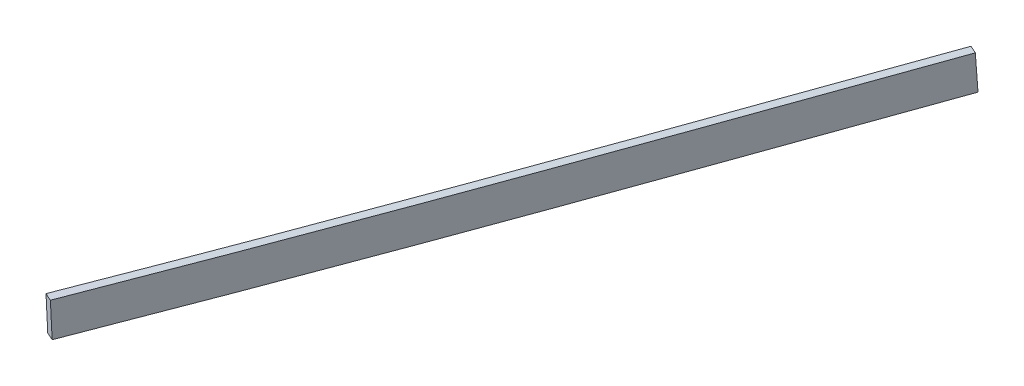
ISO-10303-21;
HEADER;
FILE_DESCRIPTION(('STEP AP214'),'2;1');
FILE_NAME('part.step','',(''),(''),'','','');
FILE_SCHEMA(('AUTOMOTIVE_DESIGN { 1 0 10303 214 1 1 1 1 }'));
ENDSEC;
DATA;
#1=APPLICATION_CONTEXT('core data for automotive mechanical design processes');
#2=APPLICATION_PROTOCOL_DEFINITION('international standard','automotive_design',2000,#1);
#3=PRODUCT_CONTEXT('',#1,'mechanical');
#4=PRODUCT('Part','Part','',(#3));
#5=PRODUCT_RELATED_PRODUCT_CATEGORY('part','',(#4));
#6=PRODUCT_DEFINITION_FORMATION('','',#4);
#7=PRODUCT_DEFINITION_CONTEXT('part definition',#1,'design');
#8=PRODUCT_DEFINITION('design','',#6,#7);
#9=PRODUCT_DEFINITION_SHAPE('','',#8);
#10=(LENGTH_UNIT() NAMED_UNIT(*) SI_UNIT(.MILLI.,.METRE.));
#11=(NAMED_UNIT(*) PLANE_ANGLE_UNIT() SI_UNIT($,.RADIAN.));
#12=(NAMED_UNIT(*) SI_UNIT($,.STERADIAN.) SOLID_ANGLE_UNIT());
#13=UNCERTAINTY_MEASURE_WITH_UNIT(LENGTH_MEASURE(1.E-05),#10,'distance_accuracy_value','');
#14=(GEOMETRIC_REPRESENTATION_CONTEXT(3) GLOBAL_UNCERTAINTY_ASSIGNED_CONTEXT((#13)) GLOBAL_UNIT_ASSIGNED_CONTEXT((#10,
#11,#12)) REPRESENTATION_CONTEXT('',''));
#15=CARTESIAN_POINT('',(0.,0.,0.));
#16=DIRECTION('',(0.,0.,1.));
#17=DIRECTION('',(1.,0.,0.));
#18=AXIS2_PLACEMENT_3D('',#15,#16,#17);
#19=CARTESIAN_POINT('',(266.740201199702,51.6279188306267,-93.572103079141));
#20=DIRECTION('',(-0.407263419163679,-0.0384602271632021,0.912500585390313));
#21=DIRECTION('',(0.913176215468958,0.,0.407564963535621));
#22=AXIS2_PLACEMENT_3D('',#19,#20,#21);
#23=PLANE('',#22);
#24=DIRECTION('',(0.0156750410813428,-0.999260131760772,-0.035120964686969));
#25=VECTOR('',#24,1.);
#26=CARTESIAN_POINT('',(269.639535683816,51.6279188306267,-92.2780843199155));
#27=LINE('',#26,#25);
#28=CARTESIAN_POINT('',(269.639535683817,51.6279188306267,-92.2780843199158));
#29=VERTEX_POINT('',#28);
#30=CARTESIAN_POINT('',(269.838608705549,38.9373151572649,-92.72412057144));
#31=VERTEX_POINT('',#30);
#32=EDGE_CURVE('E143',#29,#31,#27,.T.);
#33=ORIENTED_EDGE('',*,*,#32,.F.);
#34=DIRECTION('',(0.913176215468957,0.,0.407564963535621));
#35=VECTOR('',#34,1.);
#36=CARTESIAN_POINT('',(266.740201199703,51.6279188306267,-93.5721030791414));
#37=LINE('',#36,#35);
#38=CARTESIAN_POINT('',(266.740201199703,51.6279188306267,-93.5721030791414));
#39=VERTEX_POINT('',#38);
#40=EDGE_CURVE('E11',#39,#29,#37,.T.);
#41=ORIENTED_EDGE('',*,*,#40,.F.);
#42=DIRECTION('',(0.0156750410813428,-0.999260131760772,-0.035120964686969));
#43=VECTOR('',#42,1.);
#44=CARTESIAN_POINT('',(266.740201199702,51.6279188306267,-93.572103079141));
#45=LINE('',#44,#43);
#46=CARTESIAN_POINT('',(266.939274221436,38.9373151572649,-94.0181393306655));
#47=VERTEX_POINT('',#46);
#48=EDGE_CURVE('E97',#39,#47,#45,.T.);
#49=ORIENTED_EDGE('',*,*,#48,.T.);
#50=DIRECTION('',(0.913176215468957,0.,0.407564963535621));
#51=VECTOR('',#50,1.);
#52=CARTESIAN_POINT('',(266.939274221436,38.9373151572649,-94.0181393306655));
#53=LINE('',#52,#51);
#54=EDGE_CURVE('E75',#47,#31,#53,.T.);
#55=ORIENTED_EDGE('',*,*,#54,.T.);
#56=EDGE_LOOP('',(#33,#41,#49,#55));
#57=FACE_BOUND('',#56,.T.);
#58=ADVANCED_FACE('F33',(#57),#23,.T.);
#59=CARTESIAN_POINT('',(266.740201199703,51.6279188306267,-93.5721030791414));
#60=CARTESIAN_POINT('',(274.741094189838,52.3834891751003,-111.498632184398));
#61=CARTESIAN_POINT('',(282.740685310047,53.2139950698426,-129.422244364111));
#62=CARTESIAN_POINT('',(299.716643868591,55.1430619480945,-167.458000568396));
#63=CARTESIAN_POINT('',(308.692490791679,56.2627633004101,-187.568978344183));
#64=CARTESIAN_POINT('',(326.640254293075,58.6736155613576,-227.782127698725));
#65=CARTESIAN_POINT('',(335.612247948456,59.966397282195,-247.884471973752));
#66=CARTESIAN_POINT('',(349.068851482578,61.9581908760458,-278.034880835583));
#67=CARTESIAN_POINT('',(353.554188243958,62.6302394569347,-288.084574050938));
#68=CARTESIAN_POINT('',(362.525060939875,63.966160816728,-308.184406742262));
#69=CARTESIAN_POINT('',(367.010593434645,64.6301747936809,-318.234538511205));
#70=CARTESIAN_POINT('',(371.496665515891,65.2720394398243,-328.285879259279));
#71=B_SPLINE_CURVE_WITH_KNOTS('',3,(#59,#60,#61,#62,#63,#64,#65,#66,#67,#68,#69,#70),
.UNSPECIFIED.,.F.,.F.,(4,2,2,2,2,4),(0.0272758163662018,0.25,0.5,0.75,0.875,1.),.UNSPECIFIED.);
#72=DIRECTION('',(0.913176215468957,0.,0.407564963535621));
#73=VECTOR('',#72,1.);
#74=SURFACE_OF_LINEAR_EXTRUSION('',#71,#73);
#75=CARTESIAN_POINT('',(269.639535683817,51.6279188306267,-92.2780843199158));
#76=CARTESIAN_POINT('',(277.640428673952,52.3834891751003,-110.204613425173));
#77=CARTESIAN_POINT('',(285.640019794161,53.2139950698426,-128.128225604885));
#78=CARTESIAN_POINT('',(302.615978352705,55.1430619480945,-166.163981809171));
#79=CARTESIAN_POINT('',(311.591825275793,56.2627633004101,-186.274959584957));
#80=CARTESIAN_POINT('',(329.539588777189,58.6736155613576,-226.4881089395));
#81=CARTESIAN_POINT('',(338.51158243257,59.966397282195,-246.590453214526));
#82=CARTESIAN_POINT('',(351.968185966692,61.9581908760458,-276.740862076358));
#83=CARTESIAN_POINT('',(356.453522728071,62.6302394569347,-286.790555291712));
#84=CARTESIAN_POINT('',(365.424395423989,63.966160816728,-306.890387983037));
#85=CARTESIAN_POINT('',(369.909927918759,64.6301747936809,-316.940519751979));
#86=CARTESIAN_POINT('',(374.396000000005,65.2720394398243,-326.991860500053));
#87=B_SPLINE_CURVE_WITH_KNOTS('',3,(#75,#76,#77,#78,#79,#80,#81,#82,#83,#84,#85,#86),
.UNSPECIFIED.,.F.,.F.,(4,2,2,2,2,4),(0.0272758163662018,0.25,0.5,0.75,0.875,1.),.UNSPECIFIED.);
#88=CARTESIAN_POINT('',(374.396000000005,65.2720394398243,-326.991860500053));
#89=VERTEX_POINT('',#88);
#90=EDGE_CURVE('E66',#29,#89,#87,.T.);
#91=ORIENTED_EDGE('',*,*,#90,.T.);
#92=DIRECTION('',(0.913176215468957,0.,0.407564963535621));
#93=VECTOR('',#92,1.);
#94=CARTESIAN_POINT('',(371.496665515891,65.2720394398243,-328.285879259279));
#95=LINE('',#94,#93);
#96=CARTESIAN_POINT('',(371.496665515891,65.2720394398243,-328.285879259279));
#97=VERTEX_POINT('',#96);
#98=EDGE_CURVE('E42',#97,#89,#95,.T.);
#99=ORIENTED_EDGE('',*,*,#98,.F.);
#100=CARTESIAN_POINT('',(371.496665515891,65.2720394398243,-328.285879259279));
#101=CARTESIAN_POINT('',(367.010593434645,64.6301747936809,-318.234538511205));
#102=CARTESIAN_POINT('',(362.525060939875,63.966160816728,-308.184406742262));
#103=CARTESIAN_POINT('',(353.554188243958,62.6302394569347,-288.084574050938));
#104=CARTESIAN_POINT('',(349.068851482578,61.9581908760458,-278.034880835583));
#105=CARTESIAN_POINT('',(335.612247948456,59.966397282195,-247.884471973752));
#106=CARTESIAN_POINT('',(326.640254293075,58.6736155613576,-227.782127698725));
#107=CARTESIAN_POINT('',(308.692490791679,56.2627633004101,-187.568978344183));
#108=CARTESIAN_POINT('',(299.716643868591,55.1430619480945,-167.458000568396));
#109=CARTESIAN_POINT('',(282.740685310047,53.2139950698426,-129.422244364111));
#110=CARTESIAN_POINT('',(274.741094189838,52.3834891751003,-111.498632184398));
#111=CARTESIAN_POINT('',(266.740201199703,51.6279188306267,-93.5721030791414));
#112=B_SPLINE_CURVE_WITH_KNOTS('',3,(#100,#101,#102,#103,#104,#105,#106,#107,#108,#109,#110,
#111),.UNSPECIFIED.,.F.,.F.,(4,2,2,2,2,4),(0.0272758163662019,0.152275816366202,
0.277275816366202,0.527275816366202,0.777275816366202,1.),.UNSPECIFIED.);
#113=EDGE_CURVE('E85',#39,#97,#112,.F.);
#114=ORIENTED_EDGE('',*,*,#113,.F.);
#115=ORIENTED_EDGE('',*,*,#40,.T.);
#116=EDGE_LOOP('',(#91,#99,#114,#115));
#117=FACE_BOUND('',#116,.T.);
#118=ADVANCED_FACE('F115',(#117),#74,.F.);
#119=CARTESIAN_POINT('',(371.496665515891,65.2720394398243,-328.285879259279));
#120=DIRECTION('',(-0.406873755078003,-0.0582152658491739,0.911627517273823));
#121=DIRECTION('',(0.913176215468957,0.,0.407564963535621));
#122=AXIS2_PLACEMENT_3D('',#119,#120,#121);
#123=PLANE('',#122);
#124=DIRECTION('',(0.0237265027030375,-0.998304053293439,-0.0531607961506668));
#125=VECTOR('',#124,1.);
#126=CARTESIAN_POINT('',(374.396000000005,65.2720394398243,-326.991860500053));
#127=LINE('',#126,#125);
#128=CARTESIAN_POINT('',(374.697326584333,52.5935779629976,-327.667002611167));
#129=VERTEX_POINT('',#128);
#130=EDGE_CURVE('E93',#89,#129,#127,.T.);
#131=ORIENTED_EDGE('',*,*,#130,.T.);
#132=DIRECTION('',(0.913176215468957,0.,0.407564963535621));
#133=VECTOR('',#132,1.);
#134=CARTESIAN_POINT('',(371.797992100219,52.5935779629976,-328.961021370392));
#135=LINE('',#134,#133);
#136=CARTESIAN_POINT('',(371.797992100219,52.5935779629976,-328.961021370392));
#137=VERTEX_POINT('',#136);
#138=EDGE_CURVE('E90',#137,#129,#135,.T.);
#139=ORIENTED_EDGE('',*,*,#138,.F.);
#140=DIRECTION('',(0.0237265027030375,-0.998304053293439,-0.0531607961506668));
#141=VECTOR('',#140,1.);
#142=CARTESIAN_POINT('',(371.496665515891,65.2720394398243,-328.285879259279));
#143=LINE('',#142,#141);
#144=EDGE_CURVE('E80',#97,#137,#143,.T.);
#145=ORIENTED_EDGE('',*,*,#144,.F.);
#146=ORIENTED_EDGE('',*,*,#98,.T.);
#147=EDGE_LOOP('',(#131,#139,#145,#146));
#148=FACE_BOUND('',#147,.T.);
#149=ADVANCED_FACE('F91',(#148),#123,.F.);
#150=CARTESIAN_POINT('',(266.939274221436,38.9373151572649,-94.0181393306655));
#151=CARTESIAN_POINT('',(275.689695099345,39.763667731304,-113.624035165604));
#152=CARTESIAN_POINT('',(293.187741844375,41.5958019516665,-152.829564429232));
#153=CARTESIAN_POINT('',(319.424473738435,44.9052246317205,-211.614694852244));
#154=CARTESIAN_POINT('',(341.266671964441,48.0645583010139,-260.553582386926));
#155=CARTESIAN_POINT('',(358.723535018664,50.6810235488614,-299.666836871624));
#156=CARTESIAN_POINT('',(367.438334082834,51.969800569332,-319.192919680496));
#157=CARTESIAN_POINT('',(371.797992100219,52.5935779629976,-328.961021370392));
#158=B_SPLINE_CURVE_WITH_KNOTS('',3,(#150,#151,#152,#153,#154,#155,#156,#157),.UNSPECIFIED.,.F.,
.F.,(4,1,1,1,1,4),(0.0272758163662018,0.270456862274651,0.513637908183101,0.75681895409155,
0.878409477045775,1.),.UNSPECIFIED.);
#159=DIRECTION('',(0.913176215468957,0.,0.407564963535621));
#160=VECTOR('',#159,1.);
#161=SURFACE_OF_LINEAR_EXTRUSION('',#158,#160);
#162=CARTESIAN_POINT('',(269.838608705549,38.9373151572649,-92.72412057144));
#163=CARTESIAN_POINT('',(278.589029583459,39.763667731304,-112.330016406378));
#164=CARTESIAN_POINT('',(296.087076328489,41.5958019516665,-151.535545670007));
#165=CARTESIAN_POINT('',(322.323808222549,44.9052246317205,-210.320676093019));
#166=CARTESIAN_POINT('',(344.166006448555,48.0645583010139,-259.259563627701));
#167=CARTESIAN_POINT('',(361.622869502778,50.6810235488614,-298.372818112399));
#168=CARTESIAN_POINT('',(370.337668566948,51.969800569332,-317.89890092127));
#169=CARTESIAN_POINT('',(374.697326584333,52.5935779629976,-327.667002611167));
#170=B_SPLINE_CURVE_WITH_KNOTS('',3,(#162,#163,#164,#165,#166,#167,#168,#169),.UNSPECIFIED.,.F.,
.F.,(4,1,1,1,1,4),(0.0272758163662018,0.270456862274651,0.513637908183101,0.75681895409155,
0.878409477045775,1.),.UNSPECIFIED.);
#171=EDGE_CURVE('E150',#31,#129,#170,.T.);
#172=ORIENTED_EDGE('',*,*,#171,.F.);
#173=ORIENTED_EDGE('',*,*,#54,.F.);
#174=EDGE_CURVE('E84',#47,#137,#158,.T.);
#175=ORIENTED_EDGE('',*,*,#174,.T.);
#176=ORIENTED_EDGE('',*,*,#138,.T.);
#177=EDGE_LOOP('',(#172,#173,#175,#176));
#178=FACE_BOUND('',#177,.T.);
#179=ADVANCED_FACE('F96',(#178),#161,.T.);
#180=CARTESIAN_POINT('',(319.420124734626,44.9855209189035,-211.604950622012));
#181=DIRECTION('',(-0.913176215468953,-2.31863147210214E-13,-0.40756496353563));
#182=DIRECTION('',(-0.40756496353563,0.,0.913176215468954));
#183=AXIS2_PLACEMENT_3D('',#180,#181,#182);
#184=PLANE('',#183);
#185=ORIENTED_EDGE('',*,*,#48,.F.);
#186=ORIENTED_EDGE('',*,*,#113,.T.);
#187=ORIENTED_EDGE('',*,*,#144,.T.);
#188=ORIENTED_EDGE('',*,*,#174,.F.);
#189=EDGE_LOOP('',(#185,#186,#187,#188));
#190=FACE_BOUND('',#189,.T.);
#191=ADVANCED_FACE('F83',(#190),#184,.T.);
#192=CARTESIAN_POINT('',(322.31945921874,44.9855209189035,-210.310931862786));
#193=DIRECTION('',(-0.913176215468953,-2.31863147210214E-13,-0.40756496353563));
#194=DIRECTION('',(-0.40756496353563,0.,0.913176215468954));
#195=AXIS2_PLACEMENT_3D('',#192,#193,#194);
#196=PLANE('',#195);
#197=ORIENTED_EDGE('',*,*,#32,.T.);
#198=ORIENTED_EDGE('',*,*,#171,.T.);
#199=ORIENTED_EDGE('',*,*,#130,.F.);
#200=ORIENTED_EDGE('',*,*,#90,.F.);
#201=EDGE_LOOP('',(#197,#198,#199,#200));
#202=FACE_BOUND('',#201,.T.);
#203=ADVANCED_FACE('F119',(#202),#196,.F.);
#204=CLOSED_SHELL('',(#58,#118,#149,#179,#191,#203));
#205=MANIFOLD_SOLID_BREP('B2',#204);
#206=ADVANCED_BREP_SHAPE_REPRESENTATION('',(#18,#205),#14);
#207=SHAPE_DEFINITION_REPRESENTATION(#9,#206);
ENDSEC;
END-ISO-10303-21;
